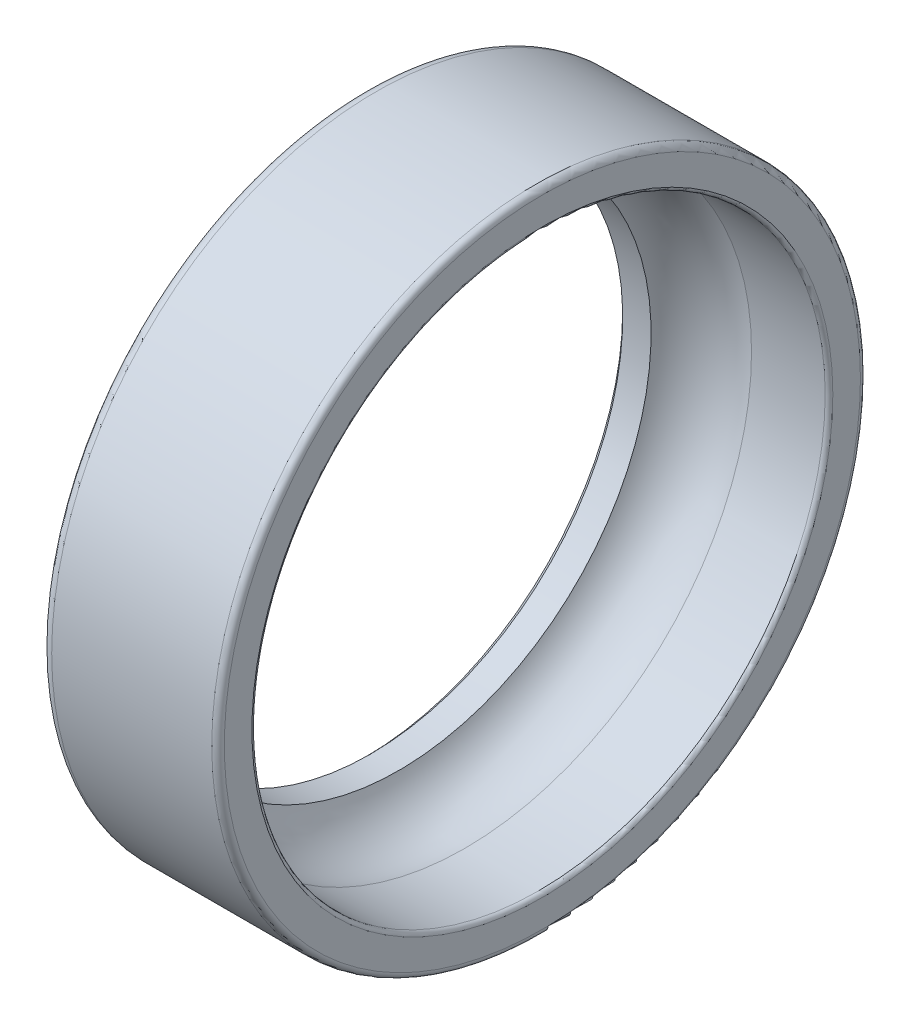
ISO-10303-21;
HEADER;
FILE_DESCRIPTION(('STEP AP214'),'2;1');
FILE_NAME('part.step','',(''),(''),'','','');
FILE_SCHEMA(('AUTOMOTIVE_DESIGN { 1 0 10303 214 1 1 1 1 }'));
ENDSEC;
DATA;
#1=APPLICATION_CONTEXT('core data for automotive mechanical design processes');
#2=APPLICATION_PROTOCOL_DEFINITION('international standard','automotive_design',2000,#1);
#3=PRODUCT_CONTEXT('',#1,'mechanical');
#4=PRODUCT('Part','Part','',(#3));
#5=PRODUCT_RELATED_PRODUCT_CATEGORY('part','',(#4));
#6=PRODUCT_DEFINITION_FORMATION('','',#4);
#7=PRODUCT_DEFINITION_CONTEXT('part definition',#1,'design');
#8=PRODUCT_DEFINITION('design','',#6,#7);
#9=PRODUCT_DEFINITION_SHAPE('','',#8);
#10=(LENGTH_UNIT() NAMED_UNIT(*) SI_UNIT(.MILLI.,.METRE.));
#11=(NAMED_UNIT(*) PLANE_ANGLE_UNIT() SI_UNIT($,.RADIAN.));
#12=(NAMED_UNIT(*) SI_UNIT($,.STERADIAN.) SOLID_ANGLE_UNIT());
#13=UNCERTAINTY_MEASURE_WITH_UNIT(LENGTH_MEASURE(1.E-05),#10,'distance_accuracy_value','');
#14=(GEOMETRIC_REPRESENTATION_CONTEXT(3) GLOBAL_UNCERTAINTY_ASSIGNED_CONTEXT((#13)) GLOBAL_UNIT_ASSIGNED_CONTEXT((#10,
#11,#12)) REPRESENTATION_CONTEXT('',''));
#15=CARTESIAN_POINT('',(0.,0.,0.));
#16=DIRECTION('',(0.,0.,1.));
#17=DIRECTION('',(1.,0.,0.));
#18=AXIS2_PLACEMENT_3D('',#15,#16,#17);
#19=CARTESIAN_POINT('',(8.5,0.,0.));
#20=DIRECTION('',(1.,0.,0.));
#21=DIRECTION('',(0.,0.,-1.));
#22=AXIS2_PLACEMENT_3D('',#19,#20,#21);
#23=TOROIDAL_SURFACE('',#22,21.75,5.75000000000001);
#24=CARTESIAN_POINT('',(9.5938349966974,0.,0.));
#25=DIRECTION('',(-1.,0.,0.));
#26=DIRECTION('',(0.,0.,1.));
#27=AXIS2_PLACEMENT_3D('',#24,#25,#26);
#28=CIRCLE('',#27,27.395);
#29=CARTESIAN_POINT('',(9.5938349966974,0.,27.395));
#30=VERTEX_POINT('',#29);
#31=EDGE_CURVE('E120',#30,#30,#28,.F.);
#32=ORIENTED_EDGE('',*,*,#31,.T.);
#33=EDGE_LOOP('',(#32));
#34=FACE_BOUND('',#33,.T.);
#35=CARTESIAN_POINT('',(3.26340998358665,0.,0.));
#36=DIRECTION('',(-1.,0.,0.));
#37=DIRECTION('',(0.,0.,1.));
#38=AXIS2_PLACEMENT_3D('',#35,#36,#37);
#39=CIRCLE('',#38,24.125);
#40=CARTESIAN_POINT('',(3.26340998358665,0.,24.125));
#41=VERTEX_POINT('',#40);
#42=EDGE_CURVE('E125',#41,#41,#39,.T.);
#43=ORIENTED_EDGE('',*,*,#42,.T.);
#44=EDGE_LOOP('',(#43));
#45=FACE_BOUND('',#44,.T.);
#46=ADVANCED_FACE('F20',(#34,#45),#23,.F.);
#47=CARTESIAN_POINT('',(17.,0.,0.));
#48=DIRECTION('',(-1.,0.,0.));
#49=DIRECTION('',(0.,0.,1.));
#50=AXIS2_PLACEMENT_3D('',#47,#48,#49);
#51=CYLINDRICAL_SURFACE('',#50,24.125);
#52=CARTESIAN_POINT('',(0.549999999999998,0.,0.));
#53=DIRECTION('',(-1.,0.,0.));
#54=DIRECTION('',(0.,0.,1.));
#55=AXIS2_PLACEMENT_3D('',#52,#53,#54);
#56=CIRCLE('',#55,24.125);
#57=CARTESIAN_POINT('',(0.549999999999998,0.,24.125));
#58=VERTEX_POINT('',#57);
#59=EDGE_CURVE('E103',#58,#58,#56,.T.);
#60=ORIENTED_EDGE('',*,*,#59,.T.);
#61=EDGE_LOOP('',(#60));
#62=FACE_BOUND('',#61,.T.);
#63=ORIENTED_EDGE('',*,*,#42,.F.);
#64=EDGE_LOOP('',(#63));
#65=FACE_BOUND('',#64,.T.);
#66=ADVANCED_FACE('F135',(#62,#65),#51,.F.);
#67=CARTESIAN_POINT('',(17.,0.,0.));
#68=DIRECTION('',(-1.,0.,0.));
#69=DIRECTION('',(0.,0.,1.));
#70=AXIS2_PLACEMENT_3D('',#67,#68,#69);
#71=CYLINDRICAL_SURFACE('',#70,27.395);
#72=ORIENTED_EDGE('',*,*,#31,.F.);
#73=EDGE_LOOP('',(#72));
#74=FACE_BOUND('',#73,.T.);
#75=CARTESIAN_POINT('',(16.6333333333333,0.,0.));
#76=DIRECTION('',(1.,0.,0.));
#77=DIRECTION('',(0.,0.,-1.));
#78=AXIS2_PLACEMENT_3D('',#75,#76,#77);
#79=CIRCLE('',#78,27.395);
#80=CARTESIAN_POINT('',(16.6333333333333,0.,-27.395));
#81=VERTEX_POINT('',#80);
#82=EDGE_CURVE('E100',#81,#81,#79,.F.);
#83=ORIENTED_EDGE('',*,*,#82,.F.);
#84=EDGE_LOOP('',(#83));
#85=FACE_BOUND('',#84,.T.);
#86=ADVANCED_FACE('F137',(#74,#85),#71,.F.);
#87=CARTESIAN_POINT('',(0.,0.,0.));
#88=DIRECTION('',(-1.,0.,0.));
#89=DIRECTION('',(0.,-1.,0.));
#90=AXIS2_PLACEMENT_3D('',#87,#88,#89);
#91=CONICAL_SURFACE('',#90,24.675,0.785398163397452);
#92=CARTESIAN_POINT('',(0.,0.,0.));
#93=DIRECTION('',(-1.,0.,0.));
#94=DIRECTION('',(0.,-1.,0.));
#95=AXIS2_PLACEMENT_3D('',#92,#93,#94);
#96=CIRCLE('',#95,24.675);
#97=CARTESIAN_POINT('',(0.,-24.675,0.));
#98=VERTEX_POINT('',#97);
#99=EDGE_CURVE('E24',#98,#98,#96,.F.);
#100=ORIENTED_EDGE('',*,*,#99,.F.);
#101=EDGE_LOOP('',(#100));
#102=FACE_BOUND('',#101,.T.);
#103=ORIENTED_EDGE('',*,*,#59,.F.);
#104=EDGE_LOOP('',(#103));
#105=FACE_BOUND('',#104,.T.);
#106=ADVANCED_FACE('F92',(#102,#105),#91,.F.);
#107=CARTESIAN_POINT('',(16.6333333333333,0.,0.));
#108=DIRECTION('',(1.,0.,0.));
#109=DIRECTION('',(0.,0.,-1.));
#110=AXIS2_PLACEMENT_3D('',#107,#108,#109);
#111=TOROIDAL_SURFACE('',#110,27.7616666666667,0.366666666666664);
#112=ORIENTED_EDGE('',*,*,#82,.T.);
#113=EDGE_LOOP('',(#112));
#114=FACE_BOUND('',#113,.T.);
#115=CARTESIAN_POINT('',(17.,0.,0.));
#116=DIRECTION('',(1.,0.,0.));
#117=DIRECTION('',(0.,0.,-1.));
#118=AXIS2_PLACEMENT_3D('',#115,#116,#117);
#119=CIRCLE('',#118,27.7616666666667);
#120=CARTESIAN_POINT('',(17.,0.,-27.7616666666667));
#121=VERTEX_POINT('',#120);
#122=EDGE_CURVE('E109',#121,#121,#119,.F.);
#123=ORIENTED_EDGE('',*,*,#122,.F.);
#124=EDGE_LOOP('',(#123));
#125=FACE_BOUND('',#124,.T.);
#126=ADVANCED_FACE('F86',(#114,#125),#111,.T.);
#127=CARTESIAN_POINT('',(0.,29.9,0.));
#128=DIRECTION('',(-1.,0.,0.));
#129=DIRECTION('',(0.,0.,1.));
#130=AXIS2_PLACEMENT_3D('',#127,#128,#129);
#131=PLANE('',#130);
#132=CARTESIAN_POINT('',(0.,0.,0.));
#133=DIRECTION('',(1.,0.,0.));
#134=DIRECTION('',(0.,0.,-1.));
#135=AXIS2_PLACEMENT_3D('',#132,#133,#134);
#136=CIRCLE('',#135,29.9);
#137=CARTESIAN_POINT('',(0.,0.,-29.9));
#138=VERTEX_POINT('',#137);
#139=EDGE_CURVE('E70',#138,#138,#136,.T.);
#140=ORIENTED_EDGE('',*,*,#139,.F.);
#141=EDGE_LOOP('',(#140));
#142=FACE_BOUND('',#141,.T.);
#143=ORIENTED_EDGE('',*,*,#99,.T.);
#144=EDGE_LOOP('',(#143));
#145=FACE_BOUND('',#144,.T.);
#146=ADVANCED_FACE('F76',(#142,#145),#131,.T.);
#147=CARTESIAN_POINT('',(17.,27.7616666666667,0.));
#148=DIRECTION('',(1.,0.,0.));
#149=DIRECTION('',(0.,0.,-1.));
#150=AXIS2_PLACEMENT_3D('',#147,#148,#149);
#151=PLANE('',#150);
#152=ORIENTED_EDGE('',*,*,#122,.T.);
#153=EDGE_LOOP('',(#152));
#154=FACE_BOUND('',#153,.T.);
#155=CARTESIAN_POINT('',(17.,0.,0.));
#156=DIRECTION('',(-1.,0.,0.));
#157=DIRECTION('',(0.,0.,-1.));
#158=AXIS2_PLACEMENT_3D('',#155,#156,#157);
#159=CIRCLE('',#158,30.4);
#160=CARTESIAN_POINT('',(17.,0.,-30.4));
#161=VERTEX_POINT('',#160);
#162=EDGE_CURVE('E32',#161,#161,#159,.T.);
#163=ORIENTED_EDGE('',*,*,#162,.F.);
#164=EDGE_LOOP('',(#163));
#165=FACE_BOUND('',#164,.T.);
#166=ADVANCED_FACE('F85',(#154,#165),#151,.T.);
#167=CARTESIAN_POINT('',(1.1,0.,0.));
#168=DIRECTION('',(1.,0.,0.));
#169=DIRECTION('',(0.,0.,-1.));
#170=AXIS2_PLACEMENT_3D('',#167,#168,#169);
#171=TOROIDAL_SURFACE('',#170,29.9,1.1);
#172=CARTESIAN_POINT('',(1.1,0.,0.));
#173=DIRECTION('',(-1.,0.,0.));
#174=DIRECTION('',(0.,0.,1.));
#175=AXIS2_PLACEMENT_3D('',#172,#173,#174);
#176=CIRCLE('',#175,31.);
#177=CARTESIAN_POINT('',(1.1,0.,31.));
#178=VERTEX_POINT('',#177);
#179=EDGE_CURVE('E27',#178,#178,#176,.F.);
#180=ORIENTED_EDGE('',*,*,#179,.F.);
#181=EDGE_LOOP('',(#180));
#182=FACE_BOUND('',#181,.T.);
#183=ORIENTED_EDGE('',*,*,#139,.T.);
#184=EDGE_LOOP('',(#183));
#185=FACE_BOUND('',#184,.T.);
#186=ADVANCED_FACE('F50',(#182,#185),#171,.T.);
#187=CARTESIAN_POINT('',(16.4,0.,0.));
#188=DIRECTION('',(1.,0.,0.));
#189=DIRECTION('',(0.,0.,-1.));
#190=AXIS2_PLACEMENT_3D('',#187,#188,#189);
#191=TOROIDAL_SURFACE('',#190,30.4,0.60000000000001);
#192=ORIENTED_EDGE('',*,*,#162,.T.);
#193=EDGE_LOOP('',(#192));
#194=FACE_BOUND('',#193,.T.);
#195=CARTESIAN_POINT('',(16.4,0.,0.));
#196=DIRECTION('',(-1.,0.,0.));
#197=DIRECTION('',(0.,0.,1.));
#198=AXIS2_PLACEMENT_3D('',#195,#196,#197);
#199=CIRCLE('',#198,31.);
#200=CARTESIAN_POINT('',(16.4,0.,31.));
#201=VERTEX_POINT('',#200);
#202=EDGE_CURVE('E11',#201,#201,#199,.T.);
#203=ORIENTED_EDGE('',*,*,#202,.F.);
#204=EDGE_LOOP('',(#203));
#205=FACE_BOUND('',#204,.T.);
#206=ADVANCED_FACE('F44',(#194,#205),#191,.T.);
#207=CARTESIAN_POINT('',(17.,0.,0.));
#208=DIRECTION('',(-1.,0.,0.));
#209=DIRECTION('',(0.,0.,1.));
#210=AXIS2_PLACEMENT_3D('',#207,#208,#209);
#211=CYLINDRICAL_SURFACE('',#210,31.);
#212=ORIENTED_EDGE('',*,*,#202,.T.);
#213=EDGE_LOOP('',(#212));
#214=FACE_BOUND('',#213,.T.);
#215=ORIENTED_EDGE('',*,*,#179,.T.);
#216=EDGE_LOOP('',(#215));
#217=FACE_BOUND('',#216,.T.);
#218=ADVANCED_FACE('F49',(#214,#217),#211,.T.);
#219=CLOSED_SHELL('',(#46,#66,#86,#106,#126,#146,#166,#186,#206,#218));
#220=MANIFOLD_SOLID_BREP('B1',#219);
#221=ADVANCED_BREP_SHAPE_REPRESENTATION('',(#18,#220),#14);
#222=SHAPE_DEFINITION_REPRESENTATION(#9,#221);
ENDSEC;
END-ISO-10303-21;
